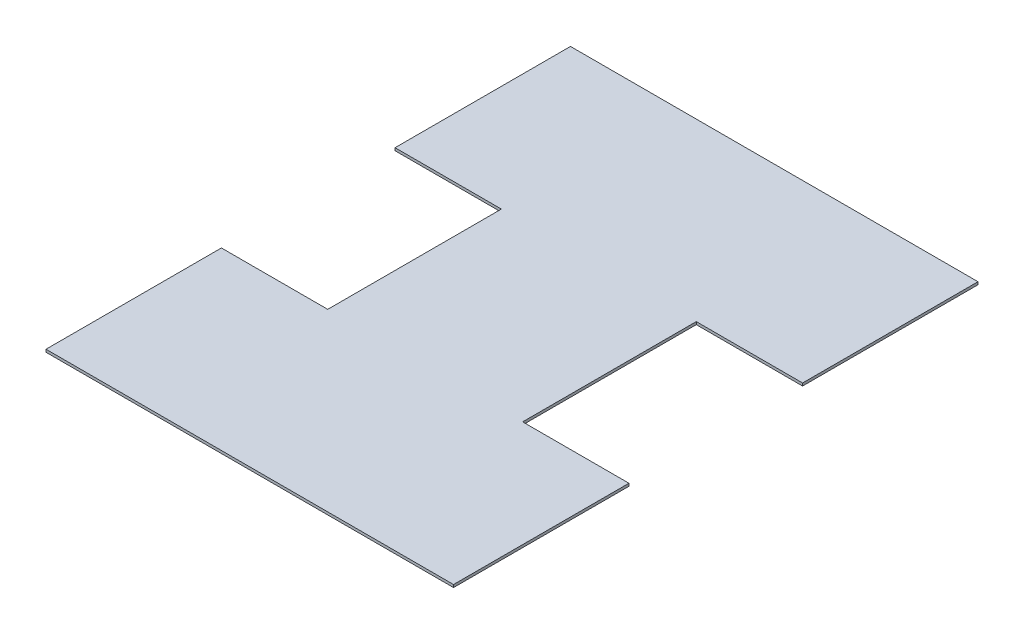
ISO-10303-21;
HEADER;
FILE_DESCRIPTION(('STEP AP214'),'2;1');
FILE_NAME('part.step','',(''),(''),'','','');
FILE_SCHEMA(('AUTOMOTIVE_DESIGN { 1 0 10303 214 1 1 1 1 }'));
ENDSEC;
DATA;
#1=APPLICATION_CONTEXT('core data for automotive mechanical design processes');
#2=APPLICATION_PROTOCOL_DEFINITION('international standard','automotive_design',2000,#1);
#3=PRODUCT_CONTEXT('',#1,'mechanical');
#4=PRODUCT('Part','Part','',(#3));
#5=PRODUCT_RELATED_PRODUCT_CATEGORY('part','',(#4));
#6=PRODUCT_DEFINITION_FORMATION('','',#4);
#7=PRODUCT_DEFINITION_CONTEXT('part definition',#1,'design');
#8=PRODUCT_DEFINITION('design','',#6,#7);
#9=PRODUCT_DEFINITION_SHAPE('','',#8);
#10=(LENGTH_UNIT() NAMED_UNIT(*) SI_UNIT(.MILLI.,.METRE.));
#11=(NAMED_UNIT(*) PLANE_ANGLE_UNIT() SI_UNIT($,.RADIAN.));
#12=(NAMED_UNIT(*) SI_UNIT($,.STERADIAN.) SOLID_ANGLE_UNIT());
#13=UNCERTAINTY_MEASURE_WITH_UNIT(LENGTH_MEASURE(1.E-05),#10,'distance_accuracy_value','');
#14=(GEOMETRIC_REPRESENTATION_CONTEXT(3) GLOBAL_UNCERTAINTY_ASSIGNED_CONTEXT((#13)) GLOBAL_UNIT_ASSIGNED_CONTEXT((#10,
#11,#12)) REPRESENTATION_CONTEXT('',''));
#15=CARTESIAN_POINT('',(0.,0.,0.));
#16=DIRECTION('',(0.,0.,1.));
#17=DIRECTION('',(1.,0.,0.));
#18=AXIS2_PLACEMENT_3D('',#15,#16,#17);
#19=CARTESIAN_POINT('',(230.,3.,-98.0000000000001));
#20=DIRECTION('',(-1.,0.,0.));
#21=DIRECTION('',(0.,0.,1.));
#22=AXIS2_PLACEMENT_3D('',#19,#20,#21);
#23=PLANE('',#22);
#24=DIRECTION('',(0.,0.,-1.));
#25=VECTOR('',#24,1.);
#26=CARTESIAN_POINT('',(230.,0.,-98.0000000000001));
#27=LINE('',#26,#25);
#28=CARTESIAN_POINT('',(230.,0.,-98.0000000000001));
#29=VERTEX_POINT('',#28);
#30=CARTESIAN_POINT('',(230.,0.,-296.));
#31=VERTEX_POINT('',#30);
#32=EDGE_CURVE('E158',#29,#31,#27,.T.);
#33=ORIENTED_EDGE('',*,*,#32,.T.);
#34=DIRECTION('',(0.,-1.,0.));
#35=VECTOR('',#34,1.);
#36=CARTESIAN_POINT('',(230.,3.,-296.));
#37=LINE('',#36,#35);
#38=CARTESIAN_POINT('',(230.,3.,-296.));
#39=VERTEX_POINT('',#38);
#40=EDGE_CURVE('E11',#39,#31,#37,.T.);
#41=ORIENTED_EDGE('',*,*,#40,.F.);
#42=DIRECTION('',(0.,0.,-1.));
#43=VECTOR('',#42,1.);
#44=CARTESIAN_POINT('',(230.,3.,-98.0000000000001));
#45=LINE('',#44,#43);
#46=CARTESIAN_POINT('',(230.,3.,-98.0000000000001));
#47=VERTEX_POINT('',#46);
#48=EDGE_CURVE('E180',#47,#39,#45,.T.);
#49=ORIENTED_EDGE('',*,*,#48,.F.);
#50=DIRECTION('',(0.,-1.,0.));
#51=VECTOR('',#50,1.);
#52=CARTESIAN_POINT('',(230.,3.,-98.0000000000001));
#53=LINE('',#52,#51);
#54=EDGE_CURVE('E154',#47,#29,#53,.T.);
#55=ORIENTED_EDGE('',*,*,#54,.T.);
#56=EDGE_LOOP('',(#33,#41,#49,#55));
#57=FACE_BOUND('',#56,.T.);
#58=ADVANCED_FACE('F38',(#57),#23,.F.);
#59=CARTESIAN_POINT('',(-230.,3.,-296.));
#60=DIRECTION('',(0.,0.,1.));
#61=DIRECTION('',(1.,0.,0.));
#62=AXIS2_PLACEMENT_3D('',#59,#60,#61);
#63=PLANE('',#62);
#64=DIRECTION('',(-1.,0.,0.));
#65=VECTOR('',#64,1.);
#66=CARTESIAN_POINT('',(-230.,0.,-296.));
#67=LINE('',#66,#65);
#68=CARTESIAN_POINT('',(-230.,0.,-296.));
#69=VERTEX_POINT('',#68);
#70=EDGE_CURVE('E161',#31,#69,#67,.T.);
#71=ORIENTED_EDGE('',*,*,#70,.T.);
#72=DIRECTION('',(0.,-1.,0.));
#73=VECTOR('',#72,1.);
#74=CARTESIAN_POINT('',(-230.,3.,-296.));
#75=LINE('',#74,#73);
#76=CARTESIAN_POINT('',(-230.,3.,-296.));
#77=VERTEX_POINT('',#76);
#78=EDGE_CURVE('E46',#77,#69,#75,.T.);
#79=ORIENTED_EDGE('',*,*,#78,.F.);
#80=DIRECTION('',(-1.,0.,0.));
#81=VECTOR('',#80,1.);
#82=CARTESIAN_POINT('',(-230.,3.,-296.));
#83=LINE('',#82,#81);
#84=EDGE_CURVE('E109',#39,#77,#83,.T.);
#85=ORIENTED_EDGE('',*,*,#84,.F.);
#86=ORIENTED_EDGE('',*,*,#40,.T.);
#87=EDGE_LOOP('',(#71,#79,#85,#86));
#88=FACE_BOUND('',#87,.T.);
#89=ADVANCED_FACE('F258',(#88),#63,.F.);
#90=CARTESIAN_POINT('',(-230.,3.,-98.));
#91=DIRECTION('',(1.,0.,0.));
#92=DIRECTION('',(0.,0.,-1.));
#93=AXIS2_PLACEMENT_3D('',#90,#91,#92);
#94=PLANE('',#93);
#95=DIRECTION('',(0.,0.,1.));
#96=VECTOR('',#95,1.);
#97=CARTESIAN_POINT('',(-230.,0.,-98.));
#98=LINE('',#97,#96);
#99=CARTESIAN_POINT('',(-230.,0.,-98.));
#100=VERTEX_POINT('',#99);
#101=EDGE_CURVE('E163',#69,#100,#98,.T.);
#102=ORIENTED_EDGE('',*,*,#101,.T.);
#103=DIRECTION('',(0.,-1.,0.));
#104=VECTOR('',#103,1.);
#105=CARTESIAN_POINT('',(-230.,3.,-98.));
#106=LINE('',#105,#104);
#107=CARTESIAN_POINT('',(-230.,3.,-98.));
#108=VERTEX_POINT('',#107);
#109=EDGE_CURVE('E199',#108,#100,#106,.T.);
#110=ORIENTED_EDGE('',*,*,#109,.F.);
#111=DIRECTION('',(0.,0.,1.));
#112=VECTOR('',#111,1.);
#113=CARTESIAN_POINT('',(-230.,3.,-98.));
#114=LINE('',#113,#112);
#115=EDGE_CURVE('E207',#77,#108,#114,.T.);
#116=ORIENTED_EDGE('',*,*,#115,.F.);
#117=ORIENTED_EDGE('',*,*,#78,.T.);
#118=EDGE_LOOP('',(#102,#110,#116,#117));
#119=FACE_BOUND('',#118,.T.);
#120=ADVANCED_FACE('F205',(#119),#94,.F.);
#121=CARTESIAN_POINT('',(-230.,3.,-98.));
#122=DIRECTION('',(0.,0.,-1.));
#123=DIRECTION('',(-1.,0.,0.));
#124=AXIS2_PLACEMENT_3D('',#121,#122,#123);
#125=PLANE('',#124);
#126=DIRECTION('',(1.,0.,0.));
#127=VECTOR('',#126,1.);
#128=CARTESIAN_POINT('',(-230.,0.,-98.));
#129=LINE('',#128,#127);
#130=CARTESIAN_POINT('',(-110.,0.,-98.));
#131=VERTEX_POINT('',#130);
#132=EDGE_CURVE('E165',#100,#131,#129,.T.);
#133=ORIENTED_EDGE('',*,*,#132,.T.);
#134=DIRECTION('',(0.,-1.,0.));
#135=VECTOR('',#134,1.);
#136=CARTESIAN_POINT('',(-110.,3.,-98.));
#137=LINE('',#136,#135);
#138=CARTESIAN_POINT('',(-110.,3.,-98.));
#139=VERTEX_POINT('',#138);
#140=EDGE_CURVE('E196',#139,#131,#137,.T.);
#141=ORIENTED_EDGE('',*,*,#140,.F.);
#142=DIRECTION('',(1.,0.,0.));
#143=VECTOR('',#142,1.);
#144=CARTESIAN_POINT('',(-230.,3.,-98.));
#145=LINE('',#144,#143);
#146=EDGE_CURVE('E225',#108,#139,#145,.T.);
#147=ORIENTED_EDGE('',*,*,#146,.F.);
#148=ORIENTED_EDGE('',*,*,#109,.T.);
#149=EDGE_LOOP('',(#133,#141,#147,#148));
#150=FACE_BOUND('',#149,.T.);
#151=ADVANCED_FACE('F216',(#150),#125,.F.);
#152=CARTESIAN_POINT('',(-110.,3.,98.));
#153=DIRECTION('',(1.,0.,0.));
#154=DIRECTION('',(0.,0.,-1.));
#155=AXIS2_PLACEMENT_3D('',#152,#153,#154);
#156=PLANE('',#155);
#157=DIRECTION('',(0.,0.,1.));
#158=VECTOR('',#157,1.);
#159=CARTESIAN_POINT('',(-110.,0.,98.));
#160=LINE('',#159,#158);
#161=CARTESIAN_POINT('',(-110.,0.,98.));
#162=VERTEX_POINT('',#161);
#163=EDGE_CURVE('E167',#131,#162,#160,.T.);
#164=ORIENTED_EDGE('',*,*,#163,.T.);
#165=DIRECTION('',(0.,-1.,0.));
#166=VECTOR('',#165,1.);
#167=CARTESIAN_POINT('',(-110.,3.,98.));
#168=LINE('',#167,#166);
#169=CARTESIAN_POINT('',(-110.,3.,98.));
#170=VERTEX_POINT('',#169);
#171=EDGE_CURVE('E193',#170,#162,#168,.T.);
#172=ORIENTED_EDGE('',*,*,#171,.F.);
#173=DIRECTION('',(0.,0.,1.));
#174=VECTOR('',#173,1.);
#175=CARTESIAN_POINT('',(-110.,3.,98.));
#176=LINE('',#175,#174);
#177=EDGE_CURVE('E222',#139,#170,#176,.T.);
#178=ORIENTED_EDGE('',*,*,#177,.F.);
#179=ORIENTED_EDGE('',*,*,#140,.T.);
#180=EDGE_LOOP('',(#164,#172,#178,#179));
#181=FACE_BOUND('',#180,.T.);
#182=ADVANCED_FACE('F220',(#181),#156,.F.);
#183=CARTESIAN_POINT('',(-230.,3.,98.));
#184=DIRECTION('',(0.,0.,1.));
#185=DIRECTION('',(1.,0.,0.));
#186=AXIS2_PLACEMENT_3D('',#183,#184,#185);
#187=PLANE('',#186);
#188=DIRECTION('',(-1.,0.,0.));
#189=VECTOR('',#188,1.);
#190=CARTESIAN_POINT('',(-230.,0.,98.));
#191=LINE('',#190,#189);
#192=CARTESIAN_POINT('',(-230.,0.,98.));
#193=VERTEX_POINT('',#192);
#194=EDGE_CURVE('E169',#162,#193,#191,.T.);
#195=ORIENTED_EDGE('',*,*,#194,.T.);
#196=DIRECTION('',(0.,-1.,0.));
#197=VECTOR('',#196,1.);
#198=CARTESIAN_POINT('',(-230.,3.,98.));
#199=LINE('',#198,#197);
#200=CARTESIAN_POINT('',(-230.,3.,98.));
#201=VERTEX_POINT('',#200);
#202=EDGE_CURVE('E190',#201,#193,#199,.T.);
#203=ORIENTED_EDGE('',*,*,#202,.F.);
#204=DIRECTION('',(-1.,0.,0.));
#205=VECTOR('',#204,1.);
#206=CARTESIAN_POINT('',(-230.,3.,98.));
#207=LINE('',#206,#205);
#208=EDGE_CURVE('E224',#170,#201,#207,.T.);
#209=ORIENTED_EDGE('',*,*,#208,.F.);
#210=ORIENTED_EDGE('',*,*,#171,.T.);
#211=EDGE_LOOP('',(#195,#203,#209,#210));
#212=FACE_BOUND('',#211,.T.);
#213=ADVANCED_FACE('F271',(#212),#187,.F.);
#214=CARTESIAN_POINT('',(-230.,3.,296.));
#215=DIRECTION('',(1.,0.,0.));
#216=DIRECTION('',(0.,0.,-1.));
#217=AXIS2_PLACEMENT_3D('',#214,#215,#216);
#218=PLANE('',#217);
#219=DIRECTION('',(0.,0.,1.));
#220=VECTOR('',#219,1.);
#221=CARTESIAN_POINT('',(-230.,0.,296.));
#222=LINE('',#221,#220);
#223=CARTESIAN_POINT('',(-230.,0.,296.));
#224=VERTEX_POINT('',#223);
#225=EDGE_CURVE('E171',#193,#224,#222,.T.);
#226=ORIENTED_EDGE('',*,*,#225,.T.);
#227=DIRECTION('',(0.,-1.,0.));
#228=VECTOR('',#227,1.);
#229=CARTESIAN_POINT('',(-230.,3.,296.));
#230=LINE('',#229,#228);
#231=CARTESIAN_POINT('',(-230.,3.,296.));
#232=VERTEX_POINT('',#231);
#233=EDGE_CURVE('E187',#232,#224,#230,.T.);
#234=ORIENTED_EDGE('',*,*,#233,.F.);
#235=DIRECTION('',(0.,0.,1.));
#236=VECTOR('',#235,1.);
#237=CARTESIAN_POINT('',(-230.,3.,296.));
#238=LINE('',#237,#236);
#239=EDGE_CURVE('E227',#201,#232,#238,.T.);
#240=ORIENTED_EDGE('',*,*,#239,.F.);
#241=ORIENTED_EDGE('',*,*,#202,.T.);
#242=EDGE_LOOP('',(#226,#234,#240,#241));
#243=FACE_BOUND('',#242,.T.);
#244=ADVANCED_FACE('F274',(#243),#218,.F.);
#245=CARTESIAN_POINT('',(-230.,3.,296.));
#246=DIRECTION('',(0.,0.,-1.));
#247=DIRECTION('',(-1.,0.,0.));
#248=AXIS2_PLACEMENT_3D('',#245,#246,#247);
#249=PLANE('',#248);
#250=DIRECTION('',(1.,0.,0.));
#251=VECTOR('',#250,1.);
#252=CARTESIAN_POINT('',(-230.,0.,296.));
#253=LINE('',#252,#251);
#254=CARTESIAN_POINT('',(230.,0.,296.));
#255=VERTEX_POINT('',#254);
#256=EDGE_CURVE('E173',#224,#255,#253,.T.);
#257=ORIENTED_EDGE('',*,*,#256,.T.);
#258=DIRECTION('',(0.,-1.,0.));
#259=VECTOR('',#258,1.);
#260=CARTESIAN_POINT('',(230.,3.,296.));
#261=LINE('',#260,#259);
#262=CARTESIAN_POINT('',(230.,3.,296.));
#263=VERTEX_POINT('',#262);
#264=EDGE_CURVE('E184',#263,#255,#261,.T.);
#265=ORIENTED_EDGE('',*,*,#264,.F.);
#266=DIRECTION('',(1.,0.,0.));
#267=VECTOR('',#266,1.);
#268=CARTESIAN_POINT('',(-230.,3.,296.));
#269=LINE('',#268,#267);
#270=EDGE_CURVE('E233',#232,#263,#269,.T.);
#271=ORIENTED_EDGE('',*,*,#270,.F.);
#272=ORIENTED_EDGE('',*,*,#233,.T.);
#273=EDGE_LOOP('',(#257,#265,#271,#272));
#274=FACE_BOUND('',#273,.T.);
#275=ADVANCED_FACE('F239',(#274),#249,.F.);
#276=CARTESIAN_POINT('',(230.,3.,296.));
#277=DIRECTION('',(-1.,0.,0.));
#278=DIRECTION('',(0.,0.,1.));
#279=AXIS2_PLACEMENT_3D('',#276,#277,#278);
#280=PLANE('',#279);
#281=DIRECTION('',(0.,0.,-1.));
#282=VECTOR('',#281,1.);
#283=CARTESIAN_POINT('',(230.,0.,296.));
#284=LINE('',#283,#282);
#285=CARTESIAN_POINT('',(230.,0.,98.0000000000001));
#286=VERTEX_POINT('',#285);
#287=EDGE_CURVE('E175',#255,#286,#284,.T.);
#288=ORIENTED_EDGE('',*,*,#287,.T.);
#289=DIRECTION('',(0.,-1.,0.));
#290=VECTOR('',#289,1.);
#291=CARTESIAN_POINT('',(230.,3.,98.0000000000001));
#292=LINE('',#291,#290);
#293=CARTESIAN_POINT('',(230.,3.,98.0000000000001));
#294=VERTEX_POINT('',#293);
#295=EDGE_CURVE('E149',#294,#286,#292,.T.);
#296=ORIENTED_EDGE('',*,*,#295,.F.);
#297=DIRECTION('',(0.,0.,-1.));
#298=VECTOR('',#297,1.);
#299=CARTESIAN_POINT('',(230.,3.,296.));
#300=LINE('',#299,#298);
#301=EDGE_CURVE('E140',#263,#294,#300,.T.);
#302=ORIENTED_EDGE('',*,*,#301,.F.);
#303=ORIENTED_EDGE('',*,*,#264,.T.);
#304=EDGE_LOOP('',(#288,#296,#302,#303));
#305=FACE_BOUND('',#304,.T.);
#306=ADVANCED_FACE('F243',(#305),#280,.F.);
#307=CARTESIAN_POINT('',(230.,3.,98.0000000000001));
#308=DIRECTION('',(0.,0.,1.));
#309=DIRECTION('',(1.,0.,0.));
#310=AXIS2_PLACEMENT_3D('',#307,#308,#309);
#311=PLANE('',#310);
#312=DIRECTION('',(-1.,0.,0.));
#313=VECTOR('',#312,1.);
#314=CARTESIAN_POINT('',(230.,0.,98.0000000000001));
#315=LINE('',#314,#313);
#316=CARTESIAN_POINT('',(110.,0.,98.));
#317=VERTEX_POINT('',#316);
#318=EDGE_CURVE('E148',#286,#317,#315,.T.);
#319=ORIENTED_EDGE('',*,*,#318,.T.);
#320=DIRECTION('',(0.,-1.,0.));
#321=VECTOR('',#320,1.);
#322=CARTESIAN_POINT('',(110.,3.,98.));
#323=LINE('',#322,#321);
#324=CARTESIAN_POINT('',(110.,3.,98.));
#325=VERTEX_POINT('',#324);
#326=EDGE_CURVE('E145',#325,#317,#323,.T.);
#327=ORIENTED_EDGE('',*,*,#326,.F.);
#328=DIRECTION('',(-1.,0.,0.));
#329=VECTOR('',#328,1.);
#330=CARTESIAN_POINT('',(230.,3.,98.0000000000001));
#331=LINE('',#330,#329);
#332=EDGE_CURVE('E134',#294,#325,#331,.T.);
#333=ORIENTED_EDGE('',*,*,#332,.F.);
#334=ORIENTED_EDGE('',*,*,#295,.T.);
#335=EDGE_LOOP('',(#319,#327,#333,#334));
#336=FACE_BOUND('',#335,.T.);
#337=ADVANCED_FACE('F146',(#336),#311,.F.);
#338=CARTESIAN_POINT('',(110.,3.,98.));
#339=DIRECTION('',(-1.,0.,0.));
#340=DIRECTION('',(0.,0.,1.));
#341=AXIS2_PLACEMENT_3D('',#338,#339,#340);
#342=PLANE('',#341);
#343=DIRECTION('',(0.,0.,-1.));
#344=VECTOR('',#343,1.);
#345=CARTESIAN_POINT('',(110.,0.,98.));
#346=LINE('',#345,#344);
#347=CARTESIAN_POINT('',(110.,0.,-98.));
#348=VERTEX_POINT('',#347);
#349=EDGE_CURVE('E95',#317,#348,#346,.T.);
#350=ORIENTED_EDGE('',*,*,#349,.T.);
#351=DIRECTION('',(0.,-1.,0.));
#352=VECTOR('',#351,1.);
#353=CARTESIAN_POINT('',(110.,3.,-98.));
#354=LINE('',#353,#352);
#355=CARTESIAN_POINT('',(110.,3.,-98.));
#356=VERTEX_POINT('',#355);
#357=EDGE_CURVE('E150',#356,#348,#354,.T.);
#358=ORIENTED_EDGE('',*,*,#357,.F.);
#359=DIRECTION('',(0.,0.,-1.));
#360=VECTOR('',#359,1.);
#361=CARTESIAN_POINT('',(110.,3.,98.));
#362=LINE('',#361,#360);
#363=EDGE_CURVE('E138',#325,#356,#362,.T.);
#364=ORIENTED_EDGE('',*,*,#363,.F.);
#365=ORIENTED_EDGE('',*,*,#326,.T.);
#366=EDGE_LOOP('',(#350,#358,#364,#365));
#367=FACE_BOUND('',#366,.T.);
#368=ADVANCED_FACE('F152',(#367),#342,.F.);
#369=CARTESIAN_POINT('',(230.,3.,-98.0000000000001));
#370=DIRECTION('',(0.,0.,-1.));
#371=DIRECTION('',(-1.,0.,0.));
#372=AXIS2_PLACEMENT_3D('',#369,#370,#371);
#373=PLANE('',#372);
#374=DIRECTION('',(1.,0.,0.));
#375=VECTOR('',#374,1.);
#376=CARTESIAN_POINT('',(230.,0.,-98.0000000000001));
#377=LINE('',#376,#375);
#378=EDGE_CURVE('E101',#348,#29,#377,.T.);
#379=ORIENTED_EDGE('',*,*,#378,.T.);
#380=ORIENTED_EDGE('',*,*,#54,.F.);
#381=DIRECTION('',(1.,0.,0.));
#382=VECTOR('',#381,1.);
#383=CARTESIAN_POINT('',(230.,3.,-98.0000000000001));
#384=LINE('',#383,#382);
#385=EDGE_CURVE('E54',#356,#47,#384,.T.);
#386=ORIENTED_EDGE('',*,*,#385,.F.);
#387=ORIENTED_EDGE('',*,*,#357,.T.);
#388=EDGE_LOOP('',(#379,#380,#386,#387));
#389=FACE_BOUND('',#388,.T.);
#390=ADVANCED_FACE('F247',(#389),#373,.F.);
#391=CARTESIAN_POINT('',(0.,3.,0.));
#392=DIRECTION('',(0.,-1.,0.));
#393=DIRECTION('',(0.,0.,-1.));
#394=AXIS2_PLACEMENT_3D('',#391,#392,#393);
#395=PLANE('',#394);
#396=ORIENTED_EDGE('',*,*,#48,.T.);
#397=ORIENTED_EDGE('',*,*,#84,.T.);
#398=ORIENTED_EDGE('',*,*,#115,.T.);
#399=ORIENTED_EDGE('',*,*,#146,.T.);
#400=ORIENTED_EDGE('',*,*,#177,.T.);
#401=ORIENTED_EDGE('',*,*,#208,.T.);
#402=ORIENTED_EDGE('',*,*,#239,.T.);
#403=ORIENTED_EDGE('',*,*,#270,.T.);
#404=ORIENTED_EDGE('',*,*,#301,.T.);
#405=ORIENTED_EDGE('',*,*,#332,.T.);
#406=ORIENTED_EDGE('',*,*,#363,.T.);
#407=ORIENTED_EDGE('',*,*,#385,.T.);
#408=EDGE_LOOP('',(#396,#397,#398,#399,#400,#401,#402,#403,#404,#405,#406,#407));
#409=FACE_BOUND('',#408,.T.);
#410=ADVANCED_FACE('F136',(#409),#395,.F.);
#411=CARTESIAN_POINT('',(0.,0.,0.));
#412=DIRECTION('',(0.,-1.,0.));
#413=DIRECTION('',(0.,0.,-1.));
#414=AXIS2_PLACEMENT_3D('',#411,#412,#413);
#415=PLANE('',#414);
#416=ORIENTED_EDGE('',*,*,#32,.F.);
#417=ORIENTED_EDGE('',*,*,#378,.F.);
#418=ORIENTED_EDGE('',*,*,#349,.F.);
#419=ORIENTED_EDGE('',*,*,#318,.F.);
#420=ORIENTED_EDGE('',*,*,#287,.F.);
#421=ORIENTED_EDGE('',*,*,#256,.F.);
#422=ORIENTED_EDGE('',*,*,#225,.F.);
#423=ORIENTED_EDGE('',*,*,#194,.F.);
#424=ORIENTED_EDGE('',*,*,#163,.F.);
#425=ORIENTED_EDGE('',*,*,#132,.F.);
#426=ORIENTED_EDGE('',*,*,#101,.F.);
#427=ORIENTED_EDGE('',*,*,#70,.F.);
#428=EDGE_LOOP('',(#416,#417,#418,#419,#420,#421,#422,#423,#424,#425,#426,#427));
#429=FACE_BOUND('',#428,.T.);
#430=ADVANCED_FACE('F211',(#429),#415,.T.);
#431=CLOSED_SHELL('',(#58,#89,#120,#151,#182,#213,#244,#275,#306,#337,#368,#390,#410,#430));
#432=MANIFOLD_SOLID_BREP('B2',#431);
#433=ADVANCED_BREP_SHAPE_REPRESENTATION('',(#18,#432),#14);
#434=SHAPE_DEFINITION_REPRESENTATION(#9,#433);
ENDSEC;
END-ISO-10303-21;
